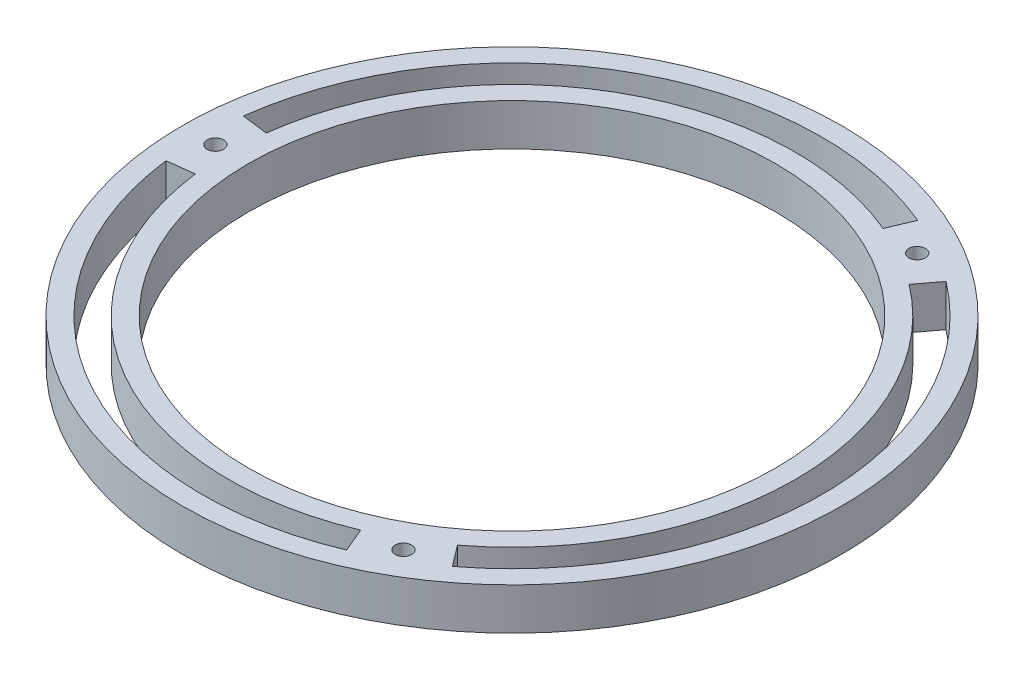
ISO-10303-21;
HEADER;
FILE_DESCRIPTION(('STEP AP214'),'2;1');
FILE_NAME('part.step','',(''),(''),'','','');
FILE_SCHEMA(('AUTOMOTIVE_DESIGN { 1 0 10303 214 1 1 1 1 }'));
ENDSEC;
DATA;
#1=APPLICATION_CONTEXT('core data for automotive mechanical design processes');
#2=APPLICATION_PROTOCOL_DEFINITION('international standard','automotive_design',2000,#1);
#3=PRODUCT_CONTEXT('',#1,'mechanical');
#4=PRODUCT('Part','Part','',(#3));
#5=PRODUCT_RELATED_PRODUCT_CATEGORY('part','',(#4));
#6=PRODUCT_DEFINITION_FORMATION('','',#4);
#7=PRODUCT_DEFINITION_CONTEXT('part definition',#1,'design');
#8=PRODUCT_DEFINITION('design','',#6,#7);
#9=PRODUCT_DEFINITION_SHAPE('','',#8);
#10=(LENGTH_UNIT() NAMED_UNIT(*) SI_UNIT(.MILLI.,.METRE.));
#11=(NAMED_UNIT(*) PLANE_ANGLE_UNIT() SI_UNIT($,.RADIAN.));
#12=(NAMED_UNIT(*) SI_UNIT($,.STERADIAN.) SOLID_ANGLE_UNIT());
#13=UNCERTAINTY_MEASURE_WITH_UNIT(LENGTH_MEASURE(1.E-05),#10,'distance_accuracy_value','');
#14=(GEOMETRIC_REPRESENTATION_CONTEXT(3) GLOBAL_UNCERTAINTY_ASSIGNED_CONTEXT((#13)) GLOBAL_UNIT_ASSIGNED_CONTEXT((#10,
#11,#12)) REPRESENTATION_CONTEXT('',''));
#15=CARTESIAN_POINT('',(0.,0.,0.));
#16=DIRECTION('',(0.,0.,1.));
#17=DIRECTION('',(1.,0.,0.));
#18=AXIS2_PLACEMENT_3D('',#15,#16,#17);
#19=CARTESIAN_POINT('',(0.,6.35,0.));
#20=DIRECTION('',(-0.796732942804221,0.,0.604331546297664));
#21=DIRECTION('',(0.604331546297664,0.,0.796732942804221));
#22=AXIS2_PLACEMENT_3D('',#19,#20,#21);
#23=PLANE('',#22);
#24=DIRECTION('',(-0.604331546297664,0.,-0.796732942804221));
#25=VECTOR('',#24,1.);
#26=CARTESIAN_POINT('',(0.,0.,0.));
#27=LINE('',#26,#25);
#28=CARTESIAN_POINT('',(28.4035826759902,0.,37.4464483117984));
#29=VERTEX_POINT('',#28);
#30=CARTESIAN_POINT('',(25.9862564907996,0.,34.2595165405815));
#31=VERTEX_POINT('',#30);
#32=EDGE_CURVE('E212',#29,#31,#27,.T.);
#33=ORIENTED_EDGE('',*,*,#32,.T.);
#34=DIRECTION('',(0.,-1.,0.));
#35=VECTOR('',#34,1.);
#36=CARTESIAN_POINT('',(25.9862564907996,6.35,34.2595165405815));
#37=LINE('',#36,#35);
#38=CARTESIAN_POINT('',(25.9862564907996,6.35,34.2595165405815));
#39=VERTEX_POINT('',#38);
#40=EDGE_CURVE('E11',#39,#31,#37,.T.);
#41=ORIENTED_EDGE('',*,*,#40,.F.);
#42=DIRECTION('',(-0.604331546297664,0.,-0.796732942804221));
#43=VECTOR('',#42,1.);
#44=CARTESIAN_POINT('',(0.,6.35,0.));
#45=LINE('',#44,#43);
#46=CARTESIAN_POINT('',(28.4035826759902,6.35,37.4464483117984));
#47=VERTEX_POINT('',#46);
#48=EDGE_CURVE('E151',#47,#39,#45,.T.);
#49=ORIENTED_EDGE('',*,*,#48,.F.);
#50=DIRECTION('',(0.,-1.,0.));
#51=VECTOR('',#50,1.);
#52=CARTESIAN_POINT('',(28.4035826759902,6.35,37.4464483117984));
#53=LINE('',#52,#51);
#54=EDGE_CURVE('E65',#47,#29,#53,.T.);
#55=ORIENTED_EDGE('',*,*,#54,.T.);
#56=EDGE_LOOP('',(#33,#41,#49,#55));
#57=FACE_BOUND('',#56,.T.);
#58=ADVANCED_FACE('F45',(#57),#23,.F.);
#59=CARTESIAN_POINT('',(0.,6.35,0.));
#60=DIRECTION('',(0.,-1.,0.));
#61=DIRECTION('',(0.,0.,-1.));
#62=AXIS2_PLACEMENT_3D('',#59,#60,#61);
#63=CYLINDRICAL_SURFACE('',#62,43.);
#64=CARTESIAN_POINT('',(0.,0.,0.));
#65=DIRECTION('',(0.,1.,0.));
#66=DIRECTION('',(0.,0.,1.));
#67=AXIS2_PLACEMENT_3D('',#64,#65,#66);
#68=CIRCLE('',#67,43.);
#69=CARTESIAN_POINT('',(25.9862564907995,0.,-34.2595165405815));
#70=VERTEX_POINT('',#69);
#71=EDGE_CURVE('E158',#31,#70,#68,.T.);
#72=ORIENTED_EDGE('',*,*,#71,.T.);
#73=DIRECTION('',(0.,-1.,0.));
#74=VECTOR('',#73,1.);
#75=CARTESIAN_POINT('',(25.9862564907995,6.35,-34.2595165405815));
#76=LINE('',#75,#74);
#77=CARTESIAN_POINT('',(25.9862564907995,6.35,-34.2595165405815));
#78=VERTEX_POINT('',#77);
#79=EDGE_CURVE('E56',#78,#70,#76,.T.);
#80=ORIENTED_EDGE('',*,*,#79,.F.);
#81=CARTESIAN_POINT('',(0.,6.35,0.));
#82=DIRECTION('',(0.,1.,0.));
#83=DIRECTION('',(0.,0.,1.));
#84=AXIS2_PLACEMENT_3D('',#81,#82,#83);
#85=CIRCLE('',#84,43.);
#86=EDGE_CURVE('E144',#39,#78,#85,.T.);
#87=ORIENTED_EDGE('',*,*,#86,.F.);
#88=ORIENTED_EDGE('',*,*,#40,.T.);
#89=EDGE_LOOP('',(#72,#80,#87,#88));
#90=FACE_BOUND('',#89,.T.);
#91=ADVANCED_FACE('F157',(#90),#63,.T.);
#92=CARTESIAN_POINT('',(0.,6.35,0.));
#93=DIRECTION('',(0.796732942804222,0.,0.604331546297663));
#94=DIRECTION('',(0.604331546297663,0.,-0.796732942804222));
#95=AXIS2_PLACEMENT_3D('',#92,#93,#94);
#96=PLANE('',#95);
#97=DIRECTION('',(-0.604331546297663,0.,0.796732942804222));
#98=VECTOR('',#97,1.);
#99=CARTESIAN_POINT('',(0.,0.,0.));
#100=LINE('',#99,#98);
#101=CARTESIAN_POINT('',(28.4035826759902,0.,-37.4464483117984));
#102=VERTEX_POINT('',#101);
#103=EDGE_CURVE('E217',#102,#70,#100,.T.);
#104=ORIENTED_EDGE('',*,*,#103,.F.);
#105=DIRECTION('',(0.,-1.,0.));
#106=VECTOR('',#105,1.);
#107=CARTESIAN_POINT('',(28.4035826759902,6.35,-37.4464483117984));
#108=LINE('',#107,#106);
#109=CARTESIAN_POINT('',(28.4035826759902,6.35,-37.4464483117984));
#110=VERTEX_POINT('',#109);
#111=EDGE_CURVE('E103',#110,#102,#108,.T.);
#112=ORIENTED_EDGE('',*,*,#111,.F.);
#113=DIRECTION('',(-0.604331546297663,0.,0.796732942804222));
#114=VECTOR('',#113,1.);
#115=CARTESIAN_POINT('',(0.,6.35,0.));
#116=LINE('',#115,#114);
#117=EDGE_CURVE('E150',#110,#78,#116,.T.);
#118=ORIENTED_EDGE('',*,*,#117,.T.);
#119=ORIENTED_EDGE('',*,*,#79,.T.);
#120=EDGE_LOOP('',(#104,#112,#118,#119));
#121=FACE_BOUND('',#120,.T.);
#122=ADVANCED_FACE('F163',(#121),#96,.T.);
#123=CARTESIAN_POINT('',(0.,6.35,0.));
#124=DIRECTION('',(0.,-1.,0.));
#125=DIRECTION('',(0.,0.,-1.));
#126=AXIS2_PLACEMENT_3D('',#123,#124,#125);
#127=CYLINDRICAL_SURFACE('',#126,43.);
#128=CARTESIAN_POINT('',(0.,0.,0.));
#129=DIRECTION('',(0.,1.,0.));
#130=DIRECTION('',(0.,0.,1.));
#131=AXIS2_PLACEMENT_3D('',#128,#129,#130);
#132=CIRCLE('',#131,43.);
#133=CARTESIAN_POINT('',(16.6764834001168,0.,-39.6345165405815));
#134=VERTEX_POINT('',#133);
#135=CARTESIAN_POINT('',(-42.6627398909165,0.,-5.375));
#136=VERTEX_POINT('',#135);
#137=EDGE_CURVE('E197',#134,#136,#132,.T.);
#138=ORIENTED_EDGE('',*,*,#137,.T.);
#139=DIRECTION('',(0.,-1.,0.));
#140=VECTOR('',#139,1.);
#141=CARTESIAN_POINT('',(-42.6627398909165,6.35,-5.375));
#142=LINE('',#141,#140);
#143=CARTESIAN_POINT('',(-42.6627398909165,6.35,-5.375));
#144=VERTEX_POINT('',#143);
#145=EDGE_CURVE('E231',#144,#136,#142,.T.);
#146=ORIENTED_EDGE('',*,*,#145,.F.);
#147=CARTESIAN_POINT('',(0.,6.35,0.));
#148=DIRECTION('',(0.,1.,0.));
#149=DIRECTION('',(0.,0.,1.));
#150=AXIS2_PLACEMENT_3D('',#147,#148,#149);
#151=CIRCLE('',#150,43.);
#152=CARTESIAN_POINT('',(16.6764834001168,6.35,-39.6345165405815));
#153=VERTEX_POINT('',#152);
#154=EDGE_CURVE('E610',#153,#144,#151,.T.);
#155=ORIENTED_EDGE('',*,*,#154,.F.);
#156=DIRECTION('',(0.,-1.,0.));
#157=VECTOR('',#156,1.);
#158=CARTESIAN_POINT('',(16.6764834001168,6.35,-39.6345165405815));
#159=LINE('',#158,#157);
#160=EDGE_CURVE('E234',#153,#134,#159,.T.);
#161=ORIENTED_EDGE('',*,*,#160,.T.);
#162=EDGE_LOOP('',(#138,#146,#155,#161));
#163=FACE_BOUND('',#162,.T.);
#164=ADVANCED_FACE('F302',(#163),#127,.T.);
#165=CARTESIAN_POINT('',(0.,6.35,0.));
#166=DIRECTION('',(0.125,0.,-0.992156741649221));
#167=DIRECTION('',(-0.992156741649222,0.,-0.125));
#168=AXIS2_PLACEMENT_3D('',#165,#166,#167);
#169=PLANE('',#168);
#170=DIRECTION('',(0.992156741649222,0.,0.125));
#171=VECTOR('',#170,1.);
#172=CARTESIAN_POINT('',(0.,0.,0.));
#173=LINE('',#172,#171);
#174=CARTESIAN_POINT('',(-46.6313668575134,0.,-5.875));
#175=VERTEX_POINT('',#174);
#176=EDGE_CURVE('E201',#175,#136,#173,.T.);
#177=ORIENTED_EDGE('',*,*,#176,.F.);
#178=DIRECTION('',(0.,-1.,0.));
#179=VECTOR('',#178,1.);
#180=CARTESIAN_POINT('',(-46.6313668575134,6.35,-5.875));
#181=LINE('',#180,#179);
#182=CARTESIAN_POINT('',(-46.6313668575134,6.35,-5.875));
#183=VERTEX_POINT('',#182);
#184=EDGE_CURVE('E241',#183,#175,#181,.T.);
#185=ORIENTED_EDGE('',*,*,#184,.F.);
#186=DIRECTION('',(0.992156741649222,0.,0.125));
#187=VECTOR('',#186,1.);
#188=CARTESIAN_POINT('',(0.,6.35,0.));
#189=LINE('',#188,#187);
#190=EDGE_CURVE('E613',#183,#144,#189,.T.);
#191=ORIENTED_EDGE('',*,*,#190,.T.);
#192=ORIENTED_EDGE('',*,*,#145,.T.);
#193=EDGE_LOOP('',(#177,#185,#191,#192));
#194=FACE_BOUND('',#193,.T.);
#195=ADVANCED_FACE('F298',(#194),#169,.T.);
#196=CARTESIAN_POINT('',(0.,6.35,0.));
#197=DIRECTION('',(0.,-1.,0.));
#198=DIRECTION('',(0.,0.,-1.));
#199=AXIS2_PLACEMENT_3D('',#196,#197,#198);
#200=CYLINDRICAL_SURFACE('',#199,47.);
#201=CARTESIAN_POINT('',(0.,0.,0.));
#202=DIRECTION('',(0.,1.,0.));
#203=DIRECTION('',(0.,0.,1.));
#204=AXIS2_PLACEMENT_3D('',#201,#202,#203);
#205=CIRCLE('',#204,47.);
#206=CARTESIAN_POINT('',(18.227784181523,0.,-43.3214483117984));
#207=VERTEX_POINT('',#206);
#208=EDGE_CURVE('E205',#207,#175,#205,.T.);
#209=ORIENTED_EDGE('',*,*,#208,.F.);
#210=DIRECTION('',(0.,-1.,0.));
#211=VECTOR('',#210,1.);
#212=CARTESIAN_POINT('',(18.227784181523,6.35,-43.3214483117984));
#213=LINE('',#212,#211);
#214=CARTESIAN_POINT('',(18.227784181523,6.35,-43.3214483117984));
#215=VERTEX_POINT('',#214);
#216=EDGE_CURVE('E238',#215,#207,#213,.T.);
#217=ORIENTED_EDGE('',*,*,#216,.F.);
#218=CARTESIAN_POINT('',(0.,6.35,0.));
#219=DIRECTION('',(0.,1.,0.));
#220=DIRECTION('',(0.,0.,1.));
#221=AXIS2_PLACEMENT_3D('',#218,#219,#220);
#222=CIRCLE('',#221,47.);
#223=EDGE_CURVE('E617',#215,#183,#222,.T.);
#224=ORIENTED_EDGE('',*,*,#223,.T.);
#225=ORIENTED_EDGE('',*,*,#184,.T.);
#226=EDGE_LOOP('',(#209,#217,#224,#225));
#227=FACE_BOUND('',#226,.T.);
#228=ADVANCED_FACE('F295',(#227),#200,.F.);
#229=CARTESIAN_POINT('',(0.,6.35,0.));
#230=DIRECTION('',(-0.125,0.,-0.992156741649221));
#231=DIRECTION('',(-0.992156741649222,0.,0.125));
#232=AXIS2_PLACEMENT_3D('',#229,#230,#231);
#233=PLANE('',#232);
#234=DIRECTION('',(0.992156741649222,0.,-0.125));
#235=VECTOR('',#234,1.);
#236=CARTESIAN_POINT('',(0.,0.,0.));
#237=LINE('',#236,#235);
#238=CARTESIAN_POINT('',(-46.6313668575134,0.,5.875));
#239=VERTEX_POINT('',#238);
#240=CARTESIAN_POINT('',(-42.6627398909165,0.,5.375));
#241=VERTEX_POINT('',#240);
#242=EDGE_CURVE('E180',#239,#241,#237,.T.);
#243=ORIENTED_EDGE('',*,*,#242,.T.);
#244=DIRECTION('',(0.,-1.,0.));
#245=VECTOR('',#244,1.);
#246=CARTESIAN_POINT('',(-42.6627398909165,6.35,5.375));
#247=LINE('',#246,#245);
#248=CARTESIAN_POINT('',(-42.6627398909165,6.35,5.375));
#249=VERTEX_POINT('',#248);
#250=EDGE_CURVE('E49',#249,#241,#247,.T.);
#251=ORIENTED_EDGE('',*,*,#250,.F.);
#252=DIRECTION('',(0.992156741649222,0.,-0.125));
#253=VECTOR('',#252,1.);
#254=CARTESIAN_POINT('',(0.,6.35,0.));
#255=LINE('',#254,#253);
#256=CARTESIAN_POINT('',(-46.6313668575134,6.35,5.875));
#257=VERTEX_POINT('',#256);
#258=EDGE_CURVE('E600',#257,#249,#255,.T.);
#259=ORIENTED_EDGE('',*,*,#258,.F.);
#260=DIRECTION('',(0.,-1.,0.));
#261=VECTOR('',#260,1.);
#262=CARTESIAN_POINT('',(-46.6313668575134,6.35,5.875));
#263=LINE('',#262,#261);
#264=EDGE_CURVE('E175',#257,#239,#263,.T.);
#265=ORIENTED_EDGE('',*,*,#264,.T.);
#266=EDGE_LOOP('',(#243,#251,#259,#265));
#267=FACE_BOUND('',#266,.T.);
#268=ADVANCED_FACE('F261',(#267),#233,.F.);
#269=CARTESIAN_POINT('',(0.,6.35,0.));
#270=DIRECTION('',(0.,-1.,0.));
#271=DIRECTION('',(0.,0.,-1.));
#272=AXIS2_PLACEMENT_3D('',#269,#270,#271);
#273=CYLINDRICAL_SURFACE('',#272,43.);
#274=CARTESIAN_POINT('',(0.,0.,0.));
#275=DIRECTION('',(0.,1.,0.));
#276=DIRECTION('',(0.,0.,1.));
#277=AXIS2_PLACEMENT_3D('',#274,#275,#276);
#278=CIRCLE('',#277,43.);
#279=CARTESIAN_POINT('',(16.6764834001168,0.,39.6345165405815));
#280=VERTEX_POINT('',#279);
#281=EDGE_CURVE('E185',#241,#280,#278,.T.);
#282=ORIENTED_EDGE('',*,*,#281,.T.);
#283=DIRECTION('',(0.,-1.,0.));
#284=VECTOR('',#283,1.);
#285=CARTESIAN_POINT('',(16.6764834001168,6.35,39.6345165405815));
#286=LINE('',#285,#284);
#287=CARTESIAN_POINT('',(16.6764834001168,6.35,39.6345165405815));
#288=VERTEX_POINT('',#287);
#289=EDGE_CURVE('E250',#288,#280,#286,.T.);
#290=ORIENTED_EDGE('',*,*,#289,.F.);
#291=CARTESIAN_POINT('',(0.,6.35,0.));
#292=DIRECTION('',(0.,1.,0.));
#293=DIRECTION('',(0.,0.,1.));
#294=AXIS2_PLACEMENT_3D('',#291,#292,#293);
#295=CIRCLE('',#294,43.);
#296=EDGE_CURVE('E116',#249,#288,#295,.T.);
#297=ORIENTED_EDGE('',*,*,#296,.F.);
#298=ORIENTED_EDGE('',*,*,#250,.T.);
#299=EDGE_LOOP('',(#282,#290,#297,#298));
#300=FACE_BOUND('',#299,.T.);
#301=ADVANCED_FACE('F257',(#300),#273,.T.);
#302=CARTESIAN_POINT('',(0.,6.35,0.));
#303=DIRECTION('',(-0.921732942804221,0.,0.387825195351554));
#304=DIRECTION('',(0.387825195351554,0.,0.921732942804221));
#305=AXIS2_PLACEMENT_3D('',#302,#303,#304);
#306=PLANE('',#305);
#307=DIRECTION('',(-0.387825195351554,0.,-0.921732942804221));
#308=VECTOR('',#307,1.);
#309=CARTESIAN_POINT('',(0.,0.,0.));
#310=LINE('',#309,#308);
#311=CARTESIAN_POINT('',(18.227784181523,0.,43.3214483117984));
#312=VERTEX_POINT('',#311);
#313=EDGE_CURVE('E189',#312,#280,#310,.T.);
#314=ORIENTED_EDGE('',*,*,#313,.F.);
#315=DIRECTION('',(0.,-1.,0.));
#316=VECTOR('',#315,1.);
#317=CARTESIAN_POINT('',(18.227784181523,6.35,43.3214483117984));
#318=LINE('',#317,#316);
#319=CARTESIAN_POINT('',(18.227784181523,6.35,43.3214483117984));
#320=VERTEX_POINT('',#319);
#321=EDGE_CURVE('E248',#320,#312,#318,.T.);
#322=ORIENTED_EDGE('',*,*,#321,.F.);
#323=DIRECTION('',(-0.387825195351554,0.,-0.921732942804221));
#324=VECTOR('',#323,1.);
#325=CARTESIAN_POINT('',(0.,6.35,0.));
#326=LINE('',#325,#324);
#327=EDGE_CURVE('E605',#320,#288,#326,.T.);
#328=ORIENTED_EDGE('',*,*,#327,.T.);
#329=ORIENTED_EDGE('',*,*,#289,.T.);
#330=EDGE_LOOP('',(#314,#322,#328,#329));
#331=FACE_BOUND('',#330,.T.);
#332=ADVANCED_FACE('F272',(#331),#306,.T.);
#333=CARTESIAN_POINT('',(0.,6.35,0.));
#334=DIRECTION('',(0.,-1.,0.));
#335=DIRECTION('',(0.,0.,-1.));
#336=AXIS2_PLACEMENT_3D('',#333,#334,#335);
#337=CYLINDRICAL_SURFACE('',#336,47.);
#338=CARTESIAN_POINT('',(0.,0.,0.));
#339=DIRECTION('',(0.,1.,0.));
#340=DIRECTION('',(0.,0.,1.));
#341=AXIS2_PLACEMENT_3D('',#338,#339,#340);
#342=CIRCLE('',#341,47.);
#343=EDGE_CURVE('E220',#29,#102,#342,.T.);
#344=ORIENTED_EDGE('',*,*,#343,.F.);
#345=ORIENTED_EDGE('',*,*,#54,.F.);
#346=CARTESIAN_POINT('',(0.,6.35,0.));
#347=DIRECTION('',(0.,1.,0.));
#348=DIRECTION('',(0.,0.,1.));
#349=AXIS2_PLACEMENT_3D('',#346,#347,#348);
#350=CIRCLE('',#349,47.);
#351=EDGE_CURVE('E165',#47,#110,#350,.T.);
#352=ORIENTED_EDGE('',*,*,#351,.T.);
#353=ORIENTED_EDGE('',*,*,#111,.T.);
#354=EDGE_LOOP('',(#344,#345,#352,#353));
#355=FACE_BOUND('',#354,.T.);
#356=ADVANCED_FACE('F274',(#355),#337,.F.);
#357=CARTESIAN_POINT('',(0.,6.35,0.));
#358=DIRECTION('',(0.921732942804221,0.,0.387825195351553));
#359=DIRECTION('',(0.387825195351553,0.,-0.921732942804221));
#360=AXIS2_PLACEMENT_3D('',#357,#358,#359);
#361=PLANE('',#360);
#362=DIRECTION('',(-0.387825195351553,0.,0.921732942804221));
#363=VECTOR('',#362,1.);
#364=CARTESIAN_POINT('',(0.,0.,0.));
#365=LINE('',#364,#363);
#366=EDGE_CURVE('E209',#207,#134,#365,.T.);
#367=ORIENTED_EDGE('',*,*,#366,.T.);
#368=ORIENTED_EDGE('',*,*,#160,.F.);
#369=DIRECTION('',(-0.387825195351553,0.,0.921732942804221));
#370=VECTOR('',#369,1.);
#371=CARTESIAN_POINT('',(0.,6.35,0.));
#372=LINE('',#371,#370);
#373=EDGE_CURVE('E621',#215,#153,#372,.T.);
#374=ORIENTED_EDGE('',*,*,#373,.F.);
#375=ORIENTED_EDGE('',*,*,#216,.T.);
#376=EDGE_LOOP('',(#367,#368,#374,#375));
#377=FACE_BOUND('',#376,.T.);
#378=ADVANCED_FACE('F280',(#377),#361,.F.);
#379=CARTESIAN_POINT('',(0.,6.35,0.));
#380=DIRECTION('',(0.,-1.,0.));
#381=DIRECTION('',(0.,0.,-1.));
#382=AXIS2_PLACEMENT_3D('',#379,#380,#381);
#383=CYLINDRICAL_SURFACE('',#382,47.);
#384=CARTESIAN_POINT('',(0.,0.,0.));
#385=DIRECTION('',(0.,1.,0.));
#386=DIRECTION('',(0.,0.,1.));
#387=AXIS2_PLACEMENT_3D('',#384,#385,#386);
#388=CIRCLE('',#387,47.);
#389=EDGE_CURVE('E193',#239,#312,#388,.T.);
#390=ORIENTED_EDGE('',*,*,#389,.F.);
#391=ORIENTED_EDGE('',*,*,#264,.F.);
#392=CARTESIAN_POINT('',(0.,6.35,0.));
#393=DIRECTION('',(0.,1.,0.));
#394=DIRECTION('',(0.,0.,1.));
#395=AXIS2_PLACEMENT_3D('',#392,#393,#394);
#396=CIRCLE('',#395,47.);
#397=EDGE_CURVE('E270',#257,#320,#396,.T.);
#398=ORIENTED_EDGE('',*,*,#397,.T.);
#399=ORIENTED_EDGE('',*,*,#321,.T.);
#400=EDGE_LOOP('',(#390,#391,#398,#399));
#401=FACE_BOUND('',#400,.T.);
#402=ADVANCED_FACE('F267',(#401),#383,.F.);
#403=CARTESIAN_POINT('',(0.,6.35,0.));
#404=DIRECTION('',(0.,-1.,0.));
#405=DIRECTION('',(0.,0.,-1.));
#406=AXIS2_PLACEMENT_3D('',#403,#404,#405);
#407=CYLINDRICAL_SURFACE('',#406,40.);
#408=CARTESIAN_POINT('',(0.,6.35,0.));
#409=DIRECTION('',(0.,1.,0.));
#410=DIRECTION('',(0.,0.,1.));
#411=AXIS2_PLACEMENT_3D('',#408,#409,#410);
#412=CIRCLE('',#411,40.);
#413=CARTESIAN_POINT('',(0.,6.35,40.));
#414=VERTEX_POINT('',#413);
#415=EDGE_CURVE('E228',#414,#414,#412,.T.);
#416=ORIENTED_EDGE('',*,*,#415,.T.);
#417=EDGE_LOOP('',(#416));
#418=FACE_BOUND('',#417,.T.);
#419=CARTESIAN_POINT('',(0.,0.,0.));
#420=DIRECTION('',(0.,1.,0.));
#421=DIRECTION('',(0.,0.,1.));
#422=AXIS2_PLACEMENT_3D('',#419,#420,#421);
#423=CIRCLE('',#422,40.);
#424=CARTESIAN_POINT('',(0.,0.,40.));
#425=VERTEX_POINT('',#424);
#426=EDGE_CURVE('E176',#425,#425,#423,.T.);
#427=ORIENTED_EDGE('',*,*,#426,.F.);
#428=EDGE_LOOP('',(#427));
#429=FACE_BOUND('',#428,.T.);
#430=ADVANCED_FACE('F47',(#418,#429),#407,.F.);
#431=CARTESIAN_POINT('',(0.,6.35,0.));
#432=DIRECTION('',(0.,-1.,0.));
#433=DIRECTION('',(0.,0.,-1.));
#434=AXIS2_PLACEMENT_3D('',#431,#432,#433);
#435=CYLINDRICAL_SURFACE('',#434,50.);
#436=CARTESIAN_POINT('',(0.,6.35,0.));
#437=DIRECTION('',(0.,1.,0.));
#438=DIRECTION('',(0.,0.,1.));
#439=AXIS2_PLACEMENT_3D('',#436,#437,#438);
#440=CIRCLE('',#439,50.);
#441=CARTESIAN_POINT('',(0.,6.35,50.));
#442=VERTEX_POINT('',#441);
#443=EDGE_CURVE('E168',#442,#442,#440,.T.);
#444=ORIENTED_EDGE('',*,*,#443,.F.);
#445=EDGE_LOOP('',(#444));
#446=FACE_BOUND('',#445,.T.);
#447=CARTESIAN_POINT('',(0.,0.,0.));
#448=DIRECTION('',(0.,1.,0.));
#449=DIRECTION('',(0.,0.,1.));
#450=AXIS2_PLACEMENT_3D('',#447,#448,#449);
#451=CIRCLE('',#450,50.);
#452=CARTESIAN_POINT('',(0.,0.,50.));
#453=VERTEX_POINT('',#452);
#454=EDGE_CURVE('E224',#453,#453,#451,.T.);
#455=ORIENTED_EDGE('',*,*,#454,.T.);
#456=EDGE_LOOP('',(#455));
#457=FACE_BOUND('',#456,.T.);
#458=ADVANCED_FACE('F310',(#446,#457),#435,.T.);
#459=CARTESIAN_POINT('',(0.,6.35,0.));
#460=DIRECTION('',(0.,1.,0.));
#461=DIRECTION('',(0.,0.,1.));
#462=AXIS2_PLACEMENT_3D('',#459,#460,#461);
#463=PLANE('',#462);
#464=CARTESIAN_POINT('',(-45.,6.35,0.));
#465=DIRECTION('',(0.,1.,0.));
#466=DIRECTION('',(0.,0.,1.));
#467=AXIS2_PLACEMENT_3D('',#464,#465,#466);
#468=CIRCLE('',#467,1.25);
#469=CARTESIAN_POINT('',(-45.,6.35,1.25));
#470=VERTEX_POINT('',#469);
#471=EDGE_CURVE('E575',#470,#470,#468,.T.);
#472=ORIENTED_EDGE('',*,*,#471,.F.);
#473=EDGE_LOOP('',(#472));
#474=FACE_BOUND('',#473,.T.);
#475=CARTESIAN_POINT('',(22.5,6.35,38.9711431702997));
#476=DIRECTION('',(0.,1.,0.));
#477=DIRECTION('',(0.,0.,1.));
#478=AXIS2_PLACEMENT_3D('',#475,#476,#477);
#479=CIRCLE('',#478,1.25);
#480=CARTESIAN_POINT('',(22.5,6.35,40.2211431702997));
#481=VERTEX_POINT('',#480);
#482=EDGE_CURVE('E580',#481,#481,#479,.T.);
#483=ORIENTED_EDGE('',*,*,#482,.F.);
#484=EDGE_LOOP('',(#483));
#485=FACE_BOUND('',#484,.T.);
#486=CARTESIAN_POINT('',(22.5,6.35,-38.9711431702997));
#487=DIRECTION('',(0.,1.,0.));
#488=DIRECTION('',(0.,0.,1.));
#489=AXIS2_PLACEMENT_3D('',#486,#487,#488);
#490=CIRCLE('',#489,1.25);
#491=CARTESIAN_POINT('',(22.5,6.35,-37.7211431702997));
#492=VERTEX_POINT('',#491);
#493=EDGE_CURVE('E587',#492,#492,#490,.T.);
#494=ORIENTED_EDGE('',*,*,#493,.F.);
#495=EDGE_LOOP('',(#494));
#496=FACE_BOUND('',#495,.T.);
#497=ORIENTED_EDGE('',*,*,#415,.F.);
#498=EDGE_LOOP('',(#497));
#499=FACE_BOUND('',#498,.T.);
#500=ORIENTED_EDGE('',*,*,#258,.T.);
#501=ORIENTED_EDGE('',*,*,#296,.T.);
#502=ORIENTED_EDGE('',*,*,#327,.F.);
#503=ORIENTED_EDGE('',*,*,#397,.F.);
#504=EDGE_LOOP('',(#500,#501,#502,#503));
#505=FACE_BOUND('',#504,.T.);
#506=ORIENTED_EDGE('',*,*,#154,.T.);
#507=ORIENTED_EDGE('',*,*,#190,.F.);
#508=ORIENTED_EDGE('',*,*,#223,.F.);
#509=ORIENTED_EDGE('',*,*,#373,.T.);
#510=EDGE_LOOP('',(#506,#507,#508,#509));
#511=FACE_BOUND('',#510,.T.);
#512=ORIENTED_EDGE('',*,*,#48,.T.);
#513=ORIENTED_EDGE('',*,*,#86,.T.);
#514=ORIENTED_EDGE('',*,*,#117,.F.);
#515=ORIENTED_EDGE('',*,*,#351,.F.);
#516=EDGE_LOOP('',(#512,#513,#514,#515));
#517=FACE_BOUND('',#516,.T.);
#518=ORIENTED_EDGE('',*,*,#443,.T.);
#519=EDGE_LOOP('',(#518));
#520=FACE_BOUND('',#519,.T.);
#521=ADVANCED_FACE('F146',(#474,#485,#496,#499,#505,#511,#517,#520),#463,.T.);
#522=CARTESIAN_POINT('',(0.,0.,0.));
#523=DIRECTION('',(0.,1.,0.));
#524=DIRECTION('',(0.,0.,1.));
#525=AXIS2_PLACEMENT_3D('',#522,#523,#524);
#526=PLANE('',#525);
#527=CARTESIAN_POINT('',(-45.,0.,0.));
#528=DIRECTION('',(0.,1.,0.));
#529=DIRECTION('',(0.,0.,1.));
#530=AXIS2_PLACEMENT_3D('',#527,#528,#529);
#531=CIRCLE('',#530,1.25);
#532=CARTESIAN_POINT('',(-45.,0.,1.25));
#533=VERTEX_POINT('',#532);
#534=EDGE_CURVE('E181',#533,#533,#531,.F.);
#535=ORIENTED_EDGE('',*,*,#534,.F.);
#536=EDGE_LOOP('',(#535));
#537=FACE_BOUND('',#536,.T.);
#538=CARTESIAN_POINT('',(22.5,0.,38.9711431702997));
#539=DIRECTION('',(0.,1.,0.));
#540=DIRECTION('',(0.,0.,1.));
#541=AXIS2_PLACEMENT_3D('',#538,#539,#540);
#542=CIRCLE('',#541,1.25);
#543=CARTESIAN_POINT('',(22.5,0.,40.2211431702997));
#544=VERTEX_POINT('',#543);
#545=EDGE_CURVE('E583',#544,#544,#542,.F.);
#546=ORIENTED_EDGE('',*,*,#545,.F.);
#547=EDGE_LOOP('',(#546));
#548=FACE_BOUND('',#547,.T.);
#549=CARTESIAN_POINT('',(22.5,0.,-38.9711431702997));
#550=DIRECTION('',(0.,1.,0.));
#551=DIRECTION('',(0.,0.,1.));
#552=AXIS2_PLACEMENT_3D('',#549,#550,#551);
#553=CIRCLE('',#552,1.25);
#554=CARTESIAN_POINT('',(22.5,0.,-37.7211431702997));
#555=VERTEX_POINT('',#554);
#556=EDGE_CURVE('E591',#555,#555,#553,.F.);
#557=ORIENTED_EDGE('',*,*,#556,.F.);
#558=EDGE_LOOP('',(#557));
#559=FACE_BOUND('',#558,.T.);
#560=ORIENTED_EDGE('',*,*,#426,.T.);
#561=EDGE_LOOP('',(#560));
#562=FACE_BOUND('',#561,.T.);
#563=ORIENTED_EDGE('',*,*,#242,.F.);
#564=ORIENTED_EDGE('',*,*,#389,.T.);
#565=ORIENTED_EDGE('',*,*,#313,.T.);
#566=ORIENTED_EDGE('',*,*,#281,.F.);
#567=EDGE_LOOP('',(#563,#564,#565,#566));
#568=FACE_BOUND('',#567,.T.);
#569=ORIENTED_EDGE('',*,*,#137,.F.);
#570=ORIENTED_EDGE('',*,*,#366,.F.);
#571=ORIENTED_EDGE('',*,*,#208,.T.);
#572=ORIENTED_EDGE('',*,*,#176,.T.);
#573=EDGE_LOOP('',(#569,#570,#571,#572));
#574=FACE_BOUND('',#573,.T.);
#575=ORIENTED_EDGE('',*,*,#32,.F.);
#576=ORIENTED_EDGE('',*,*,#343,.T.);
#577=ORIENTED_EDGE('',*,*,#103,.T.);
#578=ORIENTED_EDGE('',*,*,#71,.F.);
#579=EDGE_LOOP('',(#575,#576,#577,#578));
#580=FACE_BOUND('',#579,.T.);
#581=ORIENTED_EDGE('',*,*,#454,.F.);
#582=EDGE_LOOP('',(#581));
#583=FACE_BOUND('',#582,.T.);
#584=ADVANCED_FACE('F264',(#537,#548,#559,#562,#568,#574,#580,#583),#526,.F.);
#585=CARTESIAN_POINT('',(22.5,-0.00100000000000013,-38.9711431702997));
#586=DIRECTION('',(0.,1.,0.));
#587=DIRECTION('',(0.,0.,1.));
#588=AXIS2_PLACEMENT_3D('',#585,#586,#587);
#589=CYLINDRICAL_SURFACE('',#588,1.25);
#590=ORIENTED_EDGE('',*,*,#493,.T.);
#591=EDGE_LOOP('',(#590));
#592=FACE_BOUND('',#591,.T.);
#593=ORIENTED_EDGE('',*,*,#556,.T.);
#594=EDGE_LOOP('',(#593));
#595=FACE_BOUND('',#594,.T.);
#596=ADVANCED_FACE('F323',(#592,#595),#589,.F.);
#597=CARTESIAN_POINT('',(22.5,-0.00100000000000013,38.9711431702997));
#598=DIRECTION('',(0.,1.,0.));
#599=DIRECTION('',(0.,0.,1.));
#600=AXIS2_PLACEMENT_3D('',#597,#598,#599);
#601=CYLINDRICAL_SURFACE('',#600,1.25);
#602=ORIENTED_EDGE('',*,*,#482,.T.);
#603=EDGE_LOOP('',(#602));
#604=FACE_BOUND('',#603,.T.);
#605=ORIENTED_EDGE('',*,*,#545,.T.);
#606=EDGE_LOOP('',(#605));
#607=FACE_BOUND('',#606,.T.);
#608=ADVANCED_FACE('F330',(#604,#607),#601,.F.);
#609=CARTESIAN_POINT('',(-45.,-0.00100000000000013,0.));
#610=DIRECTION('',(0.,1.,0.));
#611=DIRECTION('',(0.,0.,1.));
#612=AXIS2_PLACEMENT_3D('',#609,#610,#611);
#613=CYLINDRICAL_SURFACE('',#612,1.25);
#614=ORIENTED_EDGE('',*,*,#471,.T.);
#615=EDGE_LOOP('',(#614));
#616=FACE_BOUND('',#615,.T.);
#617=ORIENTED_EDGE('',*,*,#534,.T.);
#618=EDGE_LOOP('',(#617));
#619=FACE_BOUND('',#618,.T.);
#620=ADVANCED_FACE('F430',(#616,#619),#613,.F.);
#621=CLOSED_SHELL('',(#58,#91,#122,#164,#195,#228,#268,#301,#332,#356,#378,#402,#430,#458,#521,
#584,#596,#608,#620));
#622=MANIFOLD_SOLID_BREP('B2',#621);
#623=ADVANCED_BREP_SHAPE_REPRESENTATION('',(#18,#622),#14);
#624=SHAPE_DEFINITION_REPRESENTATION(#9,#623);
ENDSEC;
END-ISO-10303-21;
